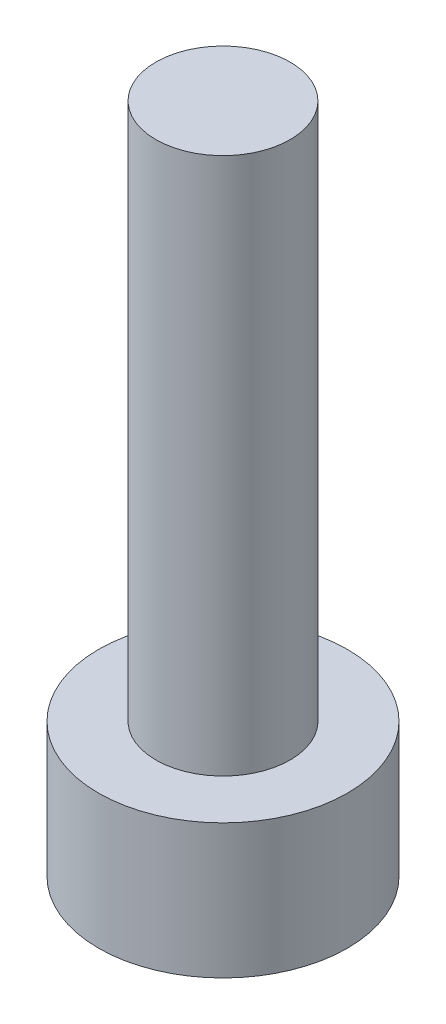
ISO-10303-21;
HEADER;
FILE_DESCRIPTION(('STEP AP214'),'2;1');
FILE_NAME('part.step','',(''),(''),'','','');
FILE_SCHEMA(('AUTOMOTIVE_DESIGN { 1 0 10303 214 1 1 1 1 }'));
ENDSEC;
DATA;
#1=APPLICATION_CONTEXT('core data for automotive mechanical design processes');
#2=APPLICATION_PROTOCOL_DEFINITION('international standard','automotive_design',2000,#1);
#3=PRODUCT_CONTEXT('',#1,'mechanical');
#4=PRODUCT('Part','Part','',(#3));
#5=PRODUCT_RELATED_PRODUCT_CATEGORY('part','',(#4));
#6=PRODUCT_DEFINITION_FORMATION('','',#4);
#7=PRODUCT_DEFINITION_CONTEXT('part definition',#1,'design');
#8=PRODUCT_DEFINITION('design','',#6,#7);
#9=PRODUCT_DEFINITION_SHAPE('','',#8);
#10=(LENGTH_UNIT() NAMED_UNIT(*) SI_UNIT(.MILLI.,.METRE.));
#11=(NAMED_UNIT(*) PLANE_ANGLE_UNIT() SI_UNIT($,.RADIAN.));
#12=(NAMED_UNIT(*) SI_UNIT($,.STERADIAN.) SOLID_ANGLE_UNIT());
#13=UNCERTAINTY_MEASURE_WITH_UNIT(LENGTH_MEASURE(1.E-05),#10,'distance_accuracy_value','');
#14=(GEOMETRIC_REPRESENTATION_CONTEXT(3) GLOBAL_UNCERTAINTY_ASSIGNED_CONTEXT((#13)) GLOBAL_UNIT_ASSIGNED_CONTEXT((#10,
#11,#12)) REPRESENTATION_CONTEXT('',''));
#15=CARTESIAN_POINT('',(0.,0.,0.));
#16=DIRECTION('',(0.,0.,1.));
#17=DIRECTION('',(1.,0.,0.));
#18=AXIS2_PLACEMENT_3D('',#15,#16,#17);
#19=CARTESIAN_POINT('',(0.,3.,0.));
#20=DIRECTION('',(0.,-1.,0.));
#21=DIRECTION('',(0.,0.,-1.));
#22=AXIS2_PLACEMENT_3D('',#19,#20,#21);
#23=CYLINDRICAL_SURFACE('',#22,2.78);
#24=CARTESIAN_POINT('',(0.,3.,0.));
#25=DIRECTION('',(0.,1.,0.));
#26=DIRECTION('',(0.,0.,1.));
#27=AXIS2_PLACEMENT_3D('',#24,#25,#26);
#28=CIRCLE('',#27,2.78);
#29=CARTESIAN_POINT('',(0.,3.,2.78));
#30=VERTEX_POINT('',#29);
#31=EDGE_CURVE('E10',#30,#30,#28,.T.);
#32=ORIENTED_EDGE('',*,*,#31,.F.);
#33=EDGE_LOOP('',(#32));
#34=FACE_BOUND('',#33,.T.);
#35=CARTESIAN_POINT('',(0.,0.,0.));
#36=DIRECTION('',(0.,1.,0.));
#37=DIRECTION('',(0.,0.,1.));
#38=AXIS2_PLACEMENT_3D('',#35,#36,#37);
#39=CIRCLE('',#38,2.78);
#40=CARTESIAN_POINT('',(0.,0.,2.78));
#41=VERTEX_POINT('',#40);
#42=EDGE_CURVE('E35',#41,#41,#39,.T.);
#43=ORIENTED_EDGE('',*,*,#42,.T.);
#44=EDGE_LOOP('',(#43));
#45=FACE_BOUND('',#44,.T.);
#46=ADVANCED_FACE('F32',(#34,#45),#23,.T.);
#47=CARTESIAN_POINT('',(0.,3.,0.));
#48=DIRECTION('',(0.,1.,0.));
#49=DIRECTION('',(0.,0.,1.));
#50=AXIS2_PLACEMENT_3D('',#47,#48,#49);
#51=PLANE('',#50);
#52=CARTESIAN_POINT('',(0.,3.,0.));
#53=DIRECTION('',(0.,1.,0.));
#54=DIRECTION('',(0.,0.,1.));
#55=AXIS2_PLACEMENT_3D('',#52,#53,#54);
#56=CIRCLE('',#55,1.5);
#57=CARTESIAN_POINT('',(0.,3.,1.5));
#58=VERTEX_POINT('',#57);
#59=EDGE_CURVE('E44',#58,#58,#56,.T.);
#60=ORIENTED_EDGE('',*,*,#59,.F.);
#61=EDGE_LOOP('',(#60));
#62=FACE_BOUND('',#61,.T.);
#63=ORIENTED_EDGE('',*,*,#31,.T.);
#64=EDGE_LOOP('',(#63));
#65=FACE_BOUND('',#64,.T.);
#66=ADVANCED_FACE('F59',(#62,#65),#51,.T.);
#67=CARTESIAN_POINT('',(0.,0.,0.));
#68=DIRECTION('',(0.,1.,0.));
#69=DIRECTION('',(0.,0.,1.));
#70=AXIS2_PLACEMENT_3D('',#67,#68,#69);
#71=PLANE('',#70);
#72=ORIENTED_EDGE('',*,*,#42,.F.);
#73=EDGE_LOOP('',(#72));
#74=FACE_BOUND('',#73,.T.);
#75=ADVANCED_FACE('F55',(#74),#71,.F.);
#76=CARTESIAN_POINT('',(0.,15.,0.));
#77=DIRECTION('',(0.,-1.,0.));
#78=DIRECTION('',(0.,0.,-1.));
#79=AXIS2_PLACEMENT_3D('',#76,#77,#78);
#80=CYLINDRICAL_SURFACE('',#79,1.5);
#81=CARTESIAN_POINT('',(0.,15.,0.));
#82=DIRECTION('',(0.,1.,0.));
#83=DIRECTION('',(0.,0.,1.));
#84=AXIS2_PLACEMENT_3D('',#81,#82,#83);
#85=CIRCLE('',#84,1.5);
#86=CARTESIAN_POINT('',(0.,15.,1.5));
#87=VERTEX_POINT('',#86);
#88=EDGE_CURVE('E42',#87,#87,#85,.T.);
#89=ORIENTED_EDGE('',*,*,#88,.F.);
#90=EDGE_LOOP('',(#89));
#91=FACE_BOUND('',#90,.T.);
#92=ORIENTED_EDGE('',*,*,#59,.T.);
#93=EDGE_LOOP('',(#92));
#94=FACE_BOUND('',#93,.T.);
#95=ADVANCED_FACE('F52',(#91,#94),#80,.T.);
#96=CARTESIAN_POINT('',(0.,15.,0.));
#97=DIRECTION('',(0.,1.,0.));
#98=DIRECTION('',(0.,0.,1.));
#99=AXIS2_PLACEMENT_3D('',#96,#97,#98);
#100=PLANE('',#99);
#101=ORIENTED_EDGE('',*,*,#88,.T.);
#102=EDGE_LOOP('',(#101));
#103=FACE_BOUND('',#102,.T.);
#104=ADVANCED_FACE('F50',(#103),#100,.T.);
#105=CLOSED_SHELL('',(#46,#66,#75,#95,#104));
#106=MANIFOLD_SOLID_BREP('B2',#105);
#107=ADVANCED_BREP_SHAPE_REPRESENTATION('',(#18,#106),#14);
#108=SHAPE_DEFINITION_REPRESENTATION(#9,#107);
ENDSEC;
END-ISO-10303-21;
